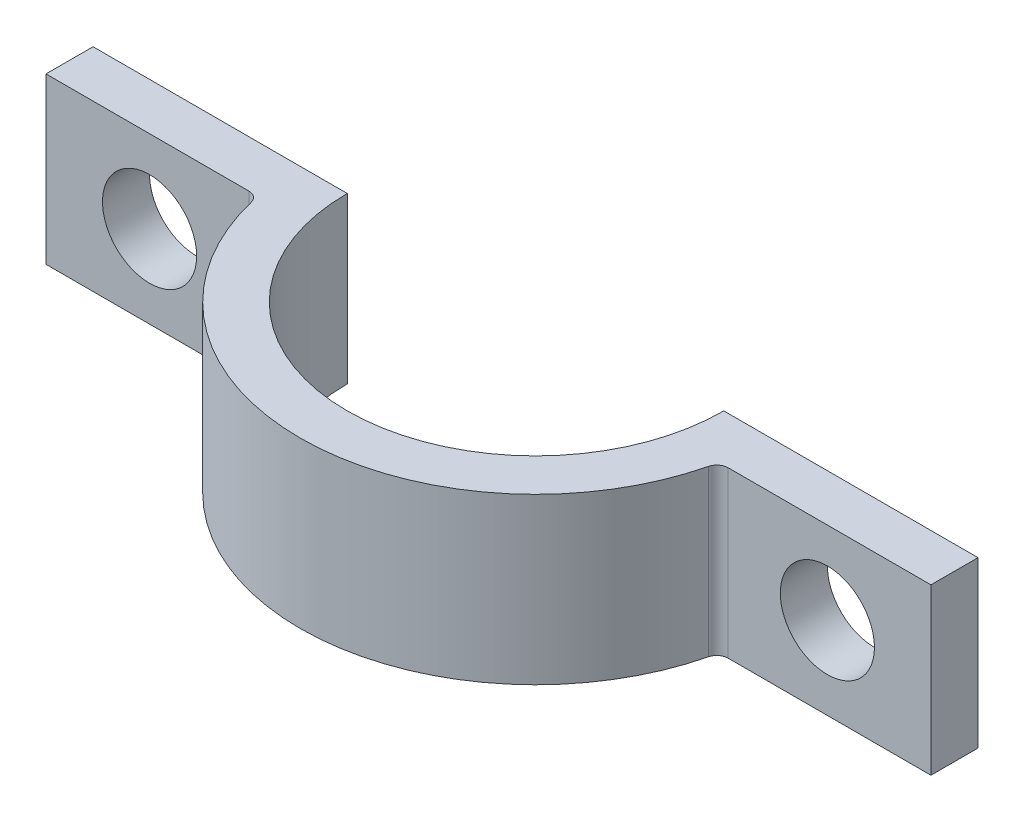
ISO-10303-21;
HEADER;
FILE_DESCRIPTION(('STEP AP214'),'2;1');
FILE_NAME('part.step','',(''),(''),'','','');
FILE_SCHEMA(('AUTOMOTIVE_DESIGN { 1 0 10303 214 1 1 1 1 }'));
ENDSEC;
DATA;
#1=APPLICATION_CONTEXT('core data for automotive mechanical design processes');
#2=APPLICATION_PROTOCOL_DEFINITION('international standard','automotive_design',2000,#1);
#3=PRODUCT_CONTEXT('',#1,'mechanical');
#4=PRODUCT('Part','Part','',(#3));
#5=PRODUCT_RELATED_PRODUCT_CATEGORY('part','',(#4));
#6=PRODUCT_DEFINITION_FORMATION('','',#4);
#7=PRODUCT_DEFINITION_CONTEXT('part definition',#1,'design');
#8=PRODUCT_DEFINITION('design','',#6,#7);
#9=PRODUCT_DEFINITION_SHAPE('','',#8);
#10=(LENGTH_UNIT() NAMED_UNIT(*) SI_UNIT(.MILLI.,.METRE.));
#11=(NAMED_UNIT(*) PLANE_ANGLE_UNIT() SI_UNIT($,.RADIAN.));
#12=(NAMED_UNIT(*) SI_UNIT($,.STERADIAN.) SOLID_ANGLE_UNIT());
#13=UNCERTAINTY_MEASURE_WITH_UNIT(LENGTH_MEASURE(1.E-05),#10,'distance_accuracy_value','');
#14=(GEOMETRIC_REPRESENTATION_CONTEXT(3) GLOBAL_UNCERTAINTY_ASSIGNED_CONTEXT((#13)) GLOBAL_UNIT_ASSIGNED_CONTEXT((#10,
#11,#12)) REPRESENTATION_CONTEXT('',''));
#15=CARTESIAN_POINT('',(0.,0.,0.));
#16=DIRECTION('',(0.,0.,1.));
#17=DIRECTION('',(1.,0.,0.));
#18=AXIS2_PLACEMENT_3D('',#15,#16,#17);
#19=CARTESIAN_POINT('',(0.,5.5626,0.));
#20=DIRECTION('',(0.,-1.,0.));
#21=DIRECTION('',(0.,0.,-1.));
#22=AXIS2_PLACEMENT_3D('',#19,#20,#21);
#23=CYLINDRICAL_SURFACE('',#22,12.7);
#24=CARTESIAN_POINT('',(0.,-5.5626,0.));
#25=DIRECTION('',(0.,-1.,0.));
#26=DIRECTION('',(0.,0.,1.));
#27=AXIS2_PLACEMENT_3D('',#24,#25,#26);
#28=CIRCLE('',#27,12.7);
#29=CARTESIAN_POINT('',(12.7,-5.5626,0.));
#30=VERTEX_POINT('',#29);
#31=CARTESIAN_POINT('',(-12.7,-5.5626,0.));
#32=VERTEX_POINT('',#31);
#33=EDGE_CURVE('E151',#30,#32,#28,.T.);
#34=ORIENTED_EDGE('',*,*,#33,.T.);
#35=DIRECTION('',(0.,-1.,0.));
#36=VECTOR('',#35,1.);
#37=CARTESIAN_POINT('',(-12.7,5.5626,0.));
#38=LINE('',#37,#36);
#39=CARTESIAN_POINT('',(-12.7,5.5626,0.));
#40=VERTEX_POINT('',#39);
#41=EDGE_CURVE('E11',#40,#32,#38,.T.);
#42=ORIENTED_EDGE('',*,*,#41,.F.);
#43=CARTESIAN_POINT('',(0.,5.5626,0.));
#44=DIRECTION('',(0.,-1.,0.));
#45=DIRECTION('',(0.,0.,1.));
#46=AXIS2_PLACEMENT_3D('',#43,#44,#45);
#47=CIRCLE('',#46,12.7);
#48=CARTESIAN_POINT('',(12.7,5.5626,0.));
#49=VERTEX_POINT('',#48);
#50=EDGE_CURVE('E170',#49,#40,#47,.T.);
#51=ORIENTED_EDGE('',*,*,#50,.F.);
#52=DIRECTION('',(0.,-1.,0.));
#53=VECTOR('',#52,1.);
#54=CARTESIAN_POINT('',(12.7,5.5626,0.));
#55=LINE('',#54,#53);
#56=EDGE_CURVE('E147',#49,#30,#55,.T.);
#57=ORIENTED_EDGE('',*,*,#56,.T.);
#58=EDGE_LOOP('',(#34,#42,#51,#57));
#59=FACE_BOUND('',#58,.T.);
#60=ADVANCED_FACE('F43',(#59),#23,.F.);
#61=CARTESIAN_POINT('',(-12.7,5.5626,0.));
#62=DIRECTION('',(0.,0.,1.));
#63=DIRECTION('',(1.,0.,0.));
#64=AXIS2_PLACEMENT_3D('',#61,#62,#63);
#65=PLANE('',#64);
#66=CARTESIAN_POINT('',(-22.86,0.,0.));
#67=DIRECTION('',(0.,0.,1.));
#68=DIRECTION('',(1.,0.,0.));
#69=AXIS2_PLACEMENT_3D('',#66,#67,#68);
#70=CIRCLE('',#69,3.175);
#71=CARTESIAN_POINT('',(-19.685,0.,0.));
#72=VERTEX_POINT('',#71);
#73=EDGE_CURVE('E155',#72,#72,#70,.T.);
#74=ORIENTED_EDGE('',*,*,#73,.T.);
#75=EDGE_LOOP('',(#74));
#76=FACE_BOUND('',#75,.T.);
#77=DIRECTION('',(-1.,0.,0.));
#78=VECTOR('',#77,1.);
#79=CARTESIAN_POINT('',(-12.7,-5.5626,0.));
#80=LINE('',#79,#78);
#81=CARTESIAN_POINT('',(-29.845,-5.5626,0.));
#82=VERTEX_POINT('',#81);
#83=EDGE_CURVE('E154',#32,#82,#80,.T.);
#84=ORIENTED_EDGE('',*,*,#83,.T.);
#85=DIRECTION('',(0.,-1.,0.));
#86=VECTOR('',#85,1.);
#87=CARTESIAN_POINT('',(-29.845,5.5626,0.));
#88=LINE('',#87,#86);
#89=CARTESIAN_POINT('',(-29.845,5.5626,0.));
#90=VERTEX_POINT('',#89);
#91=EDGE_CURVE('E51',#90,#82,#88,.T.);
#92=ORIENTED_EDGE('',*,*,#91,.F.);
#93=DIRECTION('',(-1.,0.,0.));
#94=VECTOR('',#93,1.);
#95=CARTESIAN_POINT('',(-12.7,5.5626,0.));
#96=LINE('',#95,#94);
#97=EDGE_CURVE('E108',#40,#90,#96,.T.);
#98=ORIENTED_EDGE('',*,*,#97,.F.);
#99=ORIENTED_EDGE('',*,*,#41,.T.);
#100=EDGE_LOOP('',(#84,#92,#98,#99));
#101=FACE_BOUND('',#100,.T.);
#102=ADVANCED_FACE('F229',(#76,#101),#65,.F.);
#103=CARTESIAN_POINT('',(-29.845,5.5626,0.));
#104=DIRECTION('',(1.,0.,0.));
#105=DIRECTION('',(0.,0.,-1.));
#106=AXIS2_PLACEMENT_3D('',#103,#104,#105);
#107=PLANE('',#106);
#108=DIRECTION('',(0.,0.,1.));
#109=VECTOR('',#108,1.);
#110=CARTESIAN_POINT('',(-29.845,-5.5626,0.));
#111=LINE('',#110,#109);
#112=CARTESIAN_POINT('',(-29.845,-5.5626,3.175));
#113=VERTEX_POINT('',#112);
#114=EDGE_CURVE('E157',#82,#113,#111,.T.);
#115=ORIENTED_EDGE('',*,*,#114,.T.);
#116=DIRECTION('',(0.,-1.,0.));
#117=VECTOR('',#116,1.);
#118=CARTESIAN_POINT('',(-29.845,5.5626,3.175));
#119=LINE('',#118,#117);
#120=CARTESIAN_POINT('',(-29.845,5.5626,3.175));
#121=VERTEX_POINT('',#120);
#122=EDGE_CURVE('E183',#121,#113,#119,.T.);
#123=ORIENTED_EDGE('',*,*,#122,.F.);
#124=DIRECTION('',(0.,0.,1.));
#125=VECTOR('',#124,1.);
#126=CARTESIAN_POINT('',(-29.845,5.5626,0.));
#127=LINE('',#126,#125);
#128=EDGE_CURVE('E191',#90,#121,#127,.T.);
#129=ORIENTED_EDGE('',*,*,#128,.F.);
#130=ORIENTED_EDGE('',*,*,#91,.T.);
#131=EDGE_LOOP('',(#115,#123,#129,#130));
#132=FACE_BOUND('',#131,.T.);
#133=ADVANCED_FACE('F189',(#132),#107,.F.);
#134=CARTESIAN_POINT('',(-29.845,5.5626,3.175));
#135=DIRECTION('',(0.,0.,-1.));
#136=DIRECTION('',(-1.,0.,0.));
#137=AXIS2_PLACEMENT_3D('',#134,#135,#136);
#138=PLANE('',#137);
#139=CARTESIAN_POINT('',(-22.86,0.,3.17500000000002));
#140=DIRECTION('',(0.,0.,1.));
#141=DIRECTION('',(1.,0.,0.));
#142=AXIS2_PLACEMENT_3D('',#139,#140,#141);
#143=CIRCLE('',#142,3.175);
#144=CARTESIAN_POINT('',(-19.685,0.,3.17500000000002));
#145=VERTEX_POINT('',#144);
#146=EDGE_CURVE('E223',#145,#145,#143,.T.);
#147=ORIENTED_EDGE('',*,*,#146,.F.);
#148=EDGE_LOOP('',(#147));
#149=FACE_BOUND('',#148,.T.);
#150=DIRECTION('',(1.,0.,0.));
#151=VECTOR('',#150,1.);
#152=CARTESIAN_POINT('',(-29.845,-5.5626,3.175));
#153=LINE('',#152,#151);
#154=CARTESIAN_POINT('',(-16.1644610179245,-5.5626,3.17500000000001));
#155=VERTEX_POINT('',#154);
#156=EDGE_CURVE('E159',#113,#155,#153,.T.);
#157=ORIENTED_EDGE('',*,*,#156,.T.);
#158=DIRECTION('',(0.,-1.,0.));
#159=VECTOR('',#158,1.);
#160=CARTESIAN_POINT('',(-16.1644610179245,5.5626,3.17500000000001));
#161=LINE('',#160,#159);
#162=CARTESIAN_POINT('',(-16.1644610179245,5.5626,3.17500000000001));
#163=VERTEX_POINT('',#162);
#164=EDGE_CURVE('E180',#163,#155,#161,.T.);
#165=ORIENTED_EDGE('',*,*,#164,.F.);
#166=DIRECTION('',(1.,0.,0.));
#167=VECTOR('',#166,1.);
#168=CARTESIAN_POINT('',(-29.845,5.5626,3.175));
#169=LINE('',#168,#167);
#170=EDGE_CURVE('E209',#121,#163,#169,.T.);
#171=ORIENTED_EDGE('',*,*,#170,.F.);
#172=ORIENTED_EDGE('',*,*,#122,.T.);
#173=EDGE_LOOP('',(#157,#165,#171,#172));
#174=FACE_BOUND('',#173,.T.);
#175=ADVANCED_FACE('F200',(#149,#174),#138,.F.);
#176=CARTESIAN_POINT('',(-16.1644610179245,5.5626,3.93700000000001));
#177=DIRECTION('',(0.,-1.,0.));
#178=DIRECTION('',(0.,0.,-1.));
#179=AXIS2_PLACEMENT_3D('',#176,#177,#178);
#180=CYLINDRICAL_SURFACE('',#179,0.761999999999999);
#181=CARTESIAN_POINT('',(-16.1644610179245,-5.5626,3.93700000000001));
#182=DIRECTION('',(0.,-1.,0.));
#183=DIRECTION('',(0.,0.,1.));
#184=AXIS2_PLACEMENT_3D('',#181,#182,#183);
#185=CIRCLE('',#184,0.761999999999999);
#186=CARTESIAN_POINT('',(-15.4241040247371,-5.5626,3.75667938931299));
#187=VERTEX_POINT('',#186);
#188=EDGE_CURVE('E161',#155,#187,#185,.T.);
#189=ORIENTED_EDGE('',*,*,#188,.T.);
#190=DIRECTION('',(0.,-1.,0.));
#191=VECTOR('',#190,1.);
#192=CARTESIAN_POINT('',(-15.4241040247371,5.5626,3.75667938931299));
#193=LINE('',#192,#191);
#194=CARTESIAN_POINT('',(-15.4241040247371,5.5626,3.75667938931299));
#195=VERTEX_POINT('',#194);
#196=EDGE_CURVE('E177',#195,#187,#193,.T.);
#197=ORIENTED_EDGE('',*,*,#196,.F.);
#198=CARTESIAN_POINT('',(-16.1644610179245,5.5626,3.93700000000001));
#199=DIRECTION('',(0.,-1.,0.));
#200=DIRECTION('',(0.,0.,1.));
#201=AXIS2_PLACEMENT_3D('',#198,#199,#200);
#202=CIRCLE('',#201,0.761999999999999);
#203=EDGE_CURVE('E206',#163,#195,#202,.T.);
#204=ORIENTED_EDGE('',*,*,#203,.F.);
#205=ORIENTED_EDGE('',*,*,#164,.T.);
#206=EDGE_LOOP('',(#189,#197,#204,#205));
#207=FACE_BOUND('',#206,.T.);
#208=ADVANCED_FACE('F204',(#207),#180,.F.);
#209=CARTESIAN_POINT('',(0.,5.5626,0.));
#210=DIRECTION('',(0.,-1.,0.));
#211=DIRECTION('',(0.,0.,-1.));
#212=AXIS2_PLACEMENT_3D('',#209,#210,#211);
#213=CYLINDRICAL_SURFACE('',#212,15.875);
#214=CARTESIAN_POINT('',(0.,-5.5626,0.));
#215=DIRECTION('',(0.,1.,0.));
#216=DIRECTION('',(0.,0.,1.));
#217=AXIS2_PLACEMENT_3D('',#214,#215,#216);
#218=CIRCLE('',#217,15.875);
#219=CARTESIAN_POINT('',(15.4241040247371,-5.5626,3.75667938931298));
#220=VERTEX_POINT('',#219);
#221=EDGE_CURVE('E163',#187,#220,#218,.T.);
#222=ORIENTED_EDGE('',*,*,#221,.T.);
#223=DIRECTION('',(0.,-1.,0.));
#224=VECTOR('',#223,1.);
#225=CARTESIAN_POINT('',(15.4241040247371,5.5626,3.75667938931298));
#226=LINE('',#225,#224);
#227=CARTESIAN_POINT('',(15.4241040247371,5.5626,3.75667938931298));
#228=VERTEX_POINT('',#227);
#229=EDGE_CURVE('E174',#228,#220,#226,.T.);
#230=ORIENTED_EDGE('',*,*,#229,.F.);
#231=CARTESIAN_POINT('',(0.,5.5626,0.));
#232=DIRECTION('',(0.,1.,0.));
#233=DIRECTION('',(0.,0.,1.));
#234=AXIS2_PLACEMENT_3D('',#231,#232,#233);
#235=CIRCLE('',#234,15.875);
#236=EDGE_CURVE('E208',#195,#228,#235,.T.);
#237=ORIENTED_EDGE('',*,*,#236,.F.);
#238=ORIENTED_EDGE('',*,*,#196,.T.);
#239=EDGE_LOOP('',(#222,#230,#237,#238));
#240=FACE_BOUND('',#239,.T.);
#241=ADVANCED_FACE('F245',(#240),#213,.T.);
#242=CARTESIAN_POINT('',(16.1644610179245,5.5626,3.93700000000001));
#243=DIRECTION('',(0.,-1.,0.));
#244=DIRECTION('',(0.,0.,-1.));
#245=AXIS2_PLACEMENT_3D('',#242,#243,#244);
#246=CYLINDRICAL_SURFACE('',#245,0.761999999999999);
#247=CARTESIAN_POINT('',(16.1644610179245,-5.5626,3.93700000000001));
#248=DIRECTION('',(0.,-1.,0.));
#249=DIRECTION('',(0.,0.,-1.));
#250=AXIS2_PLACEMENT_3D('',#247,#248,#249);
#251=CIRCLE('',#250,0.761999999999999);
#252=CARTESIAN_POINT('',(16.1644610179245,-5.5626,3.17500000000001));
#253=VERTEX_POINT('',#252);
#254=EDGE_CURVE('E165',#220,#253,#251,.T.);
#255=ORIENTED_EDGE('',*,*,#254,.T.);
#256=DIRECTION('',(0.,-1.,0.));
#257=VECTOR('',#256,1.);
#258=CARTESIAN_POINT('',(16.1644610179245,5.5626,3.17500000000001));
#259=LINE('',#258,#257);
#260=CARTESIAN_POINT('',(16.1644610179245,5.5626,3.17500000000001));
#261=VERTEX_POINT('',#260);
#262=EDGE_CURVE('E142',#261,#253,#259,.T.);
#263=ORIENTED_EDGE('',*,*,#262,.F.);
#264=CARTESIAN_POINT('',(16.1644610179245,5.5626,3.93700000000001));
#265=DIRECTION('',(0.,-1.,0.));
#266=DIRECTION('',(0.,0.,-1.));
#267=AXIS2_PLACEMENT_3D('',#264,#265,#266);
#268=CIRCLE('',#267,0.761999999999999);
#269=EDGE_CURVE('E133',#228,#261,#268,.T.);
#270=ORIENTED_EDGE('',*,*,#269,.F.);
#271=ORIENTED_EDGE('',*,*,#229,.T.);
#272=EDGE_LOOP('',(#255,#263,#270,#271));
#273=FACE_BOUND('',#272,.T.);
#274=ADVANCED_FACE('F257',(#273),#246,.F.);
#275=CARTESIAN_POINT('',(29.845,5.5626,3.175));
#276=DIRECTION('',(0.,0.,-1.));
#277=DIRECTION('',(-1.,0.,0.));
#278=AXIS2_PLACEMENT_3D('',#275,#276,#277);
#279=PLANE('',#278);
#280=CARTESIAN_POINT('',(22.86,0.,3.17500000000002));
#281=DIRECTION('',(0.,0.,1.));
#282=DIRECTION('',(1.,0.,0.));
#283=AXIS2_PLACEMENT_3D('',#280,#281,#282);
#284=CIRCLE('',#283,3.175);
#285=CARTESIAN_POINT('',(26.035,0.,3.17500000000002));
#286=VERTEX_POINT('',#285);
#287=EDGE_CURVE('E217',#286,#286,#284,.T.);
#288=ORIENTED_EDGE('',*,*,#287,.F.);
#289=EDGE_LOOP('',(#288));
#290=FACE_BOUND('',#289,.T.);
#291=DIRECTION('',(1.,0.,0.));
#292=VECTOR('',#291,1.);
#293=CARTESIAN_POINT('',(29.845,-5.5626,3.175));
#294=LINE('',#293,#292);
#295=CARTESIAN_POINT('',(29.845,-5.5626,3.175));
#296=VERTEX_POINT('',#295);
#297=EDGE_CURVE('E141',#253,#296,#294,.T.);
#298=ORIENTED_EDGE('',*,*,#297,.T.);
#299=DIRECTION('',(0.,-1.,0.));
#300=VECTOR('',#299,1.);
#301=CARTESIAN_POINT('',(29.845,5.5626,3.175));
#302=LINE('',#301,#300);
#303=CARTESIAN_POINT('',(29.845,5.5626,3.175));
#304=VERTEX_POINT('',#303);
#305=EDGE_CURVE('E138',#304,#296,#302,.T.);
#306=ORIENTED_EDGE('',*,*,#305,.F.);
#307=DIRECTION('',(1.,0.,0.));
#308=VECTOR('',#307,1.);
#309=CARTESIAN_POINT('',(29.845,5.5626,3.175));
#310=LINE('',#309,#308);
#311=EDGE_CURVE('E127',#261,#304,#310,.T.);
#312=ORIENTED_EDGE('',*,*,#311,.F.);
#313=ORIENTED_EDGE('',*,*,#262,.T.);
#314=EDGE_LOOP('',(#298,#306,#312,#313));
#315=FACE_BOUND('',#314,.T.);
#316=ADVANCED_FACE('F139',(#290,#315),#279,.F.);
#317=CARTESIAN_POINT('',(29.845,5.5626,0.));
#318=DIRECTION('',(-1.,0.,0.));
#319=DIRECTION('',(0.,0.,1.));
#320=AXIS2_PLACEMENT_3D('',#317,#318,#319);
#321=PLANE('',#320);
#322=DIRECTION('',(0.,0.,-1.));
#323=VECTOR('',#322,1.);
#324=CARTESIAN_POINT('',(29.845,-5.5626,0.));
#325=LINE('',#324,#323);
#326=CARTESIAN_POINT('',(29.845,-5.5626,0.));
#327=VERTEX_POINT('',#326);
#328=EDGE_CURVE('E94',#296,#327,#325,.T.);
#329=ORIENTED_EDGE('',*,*,#328,.T.);
#330=DIRECTION('',(0.,-1.,0.));
#331=VECTOR('',#330,1.);
#332=CARTESIAN_POINT('',(29.845,5.5626,0.));
#333=LINE('',#332,#331);
#334=CARTESIAN_POINT('',(29.845,5.5626,0.));
#335=VERTEX_POINT('',#334);
#336=EDGE_CURVE('E143',#335,#327,#333,.T.);
#337=ORIENTED_EDGE('',*,*,#336,.F.);
#338=DIRECTION('',(0.,0.,-1.));
#339=VECTOR('',#338,1.);
#340=CARTESIAN_POINT('',(29.845,5.5626,0.));
#341=LINE('',#340,#339);
#342=EDGE_CURVE('E131',#304,#335,#341,.T.);
#343=ORIENTED_EDGE('',*,*,#342,.F.);
#344=ORIENTED_EDGE('',*,*,#305,.T.);
#345=EDGE_LOOP('',(#329,#337,#343,#344));
#346=FACE_BOUND('',#345,.T.);
#347=ADVANCED_FACE('F145',(#346),#321,.F.);
#348=CARTESIAN_POINT('',(12.7,5.5626,0.));
#349=DIRECTION('',(0.,0.,1.));
#350=DIRECTION('',(1.,0.,0.));
#351=AXIS2_PLACEMENT_3D('',#348,#349,#350);
#352=PLANE('',#351);
#353=CARTESIAN_POINT('',(22.86,0.,0.));
#354=DIRECTION('',(0.,0.,1.));
#355=DIRECTION('',(1.,0.,0.));
#356=AXIS2_PLACEMENT_3D('',#353,#354,#355);
#357=CIRCLE('',#356,3.175);
#358=CARTESIAN_POINT('',(26.035,0.,0.));
#359=VERTEX_POINT('',#358);
#360=EDGE_CURVE('E220',#359,#359,#357,.T.);
#361=ORIENTED_EDGE('',*,*,#360,.T.);
#362=EDGE_LOOP('',(#361));
#363=FACE_BOUND('',#362,.T.);
#364=DIRECTION('',(-1.,0.,0.));
#365=VECTOR('',#364,1.);
#366=CARTESIAN_POINT('',(12.7,-5.5626,0.));
#367=LINE('',#366,#365);
#368=EDGE_CURVE('E100',#327,#30,#367,.T.);
#369=ORIENTED_EDGE('',*,*,#368,.T.);
#370=ORIENTED_EDGE('',*,*,#56,.F.);
#371=DIRECTION('',(-1.,0.,0.));
#372=VECTOR('',#371,1.);
#373=CARTESIAN_POINT('',(12.7,5.5626,0.));
#374=LINE('',#373,#372);
#375=EDGE_CURVE('E59',#335,#49,#374,.T.);
#376=ORIENTED_EDGE('',*,*,#375,.F.);
#377=ORIENTED_EDGE('',*,*,#336,.T.);
#378=EDGE_LOOP('',(#369,#370,#376,#377));
#379=FACE_BOUND('',#378,.T.);
#380=ADVANCED_FACE('F271',(#363,#379),#352,.F.);
#381=CARTESIAN_POINT('',(0.,5.5626,0.));
#382=DIRECTION('',(0.,1.,0.));
#383=DIRECTION('',(0.,0.,1.));
#384=AXIS2_PLACEMENT_3D('',#381,#382,#383);
#385=PLANE('',#384);
#386=ORIENTED_EDGE('',*,*,#50,.T.);
#387=ORIENTED_EDGE('',*,*,#97,.T.);
#388=ORIENTED_EDGE('',*,*,#128,.T.);
#389=ORIENTED_EDGE('',*,*,#170,.T.);
#390=ORIENTED_EDGE('',*,*,#203,.T.);
#391=ORIENTED_EDGE('',*,*,#236,.T.);
#392=ORIENTED_EDGE('',*,*,#269,.T.);
#393=ORIENTED_EDGE('',*,*,#311,.T.);
#394=ORIENTED_EDGE('',*,*,#342,.T.);
#395=ORIENTED_EDGE('',*,*,#375,.T.);
#396=EDGE_LOOP('',(#386,#387,#388,#389,#390,#391,#392,#393,#394,#395));
#397=FACE_BOUND('',#396,.T.);
#398=ADVANCED_FACE('F129',(#397),#385,.T.);
#399=CARTESIAN_POINT('',(0.,-5.5626,0.));
#400=DIRECTION('',(0.,1.,0.));
#401=DIRECTION('',(0.,0.,1.));
#402=AXIS2_PLACEMENT_3D('',#399,#400,#401);
#403=PLANE('',#402);
#404=ORIENTED_EDGE('',*,*,#33,.F.);
#405=ORIENTED_EDGE('',*,*,#368,.F.);
#406=ORIENTED_EDGE('',*,*,#328,.F.);
#407=ORIENTED_EDGE('',*,*,#297,.F.);
#408=ORIENTED_EDGE('',*,*,#254,.F.);
#409=ORIENTED_EDGE('',*,*,#221,.F.);
#410=ORIENTED_EDGE('',*,*,#188,.F.);
#411=ORIENTED_EDGE('',*,*,#156,.F.);
#412=ORIENTED_EDGE('',*,*,#114,.F.);
#413=ORIENTED_EDGE('',*,*,#83,.F.);
#414=EDGE_LOOP('',(#404,#405,#406,#407,#408,#409,#410,#411,#412,#413));
#415=FACE_BOUND('',#414,.T.);
#416=ADVANCED_FACE('F195',(#415),#403,.F.);
#417=CARTESIAN_POINT('',(22.86,0.,0.));
#418=DIRECTION('',(0.,0.,1.));
#419=DIRECTION('',(1.,0.,0.));
#420=AXIS2_PLACEMENT_3D('',#417,#418,#419);
#421=CYLINDRICAL_SURFACE('',#420,3.175);
#422=ORIENTED_EDGE('',*,*,#360,.F.);
#423=EDGE_LOOP('',(#422));
#424=FACE_BOUND('',#423,.T.);
#425=ORIENTED_EDGE('',*,*,#287,.T.);
#426=EDGE_LOOP('',(#425));
#427=FACE_BOUND('',#426,.T.);
#428=ADVANCED_FACE('F234',(#424,#427),#421,.F.);
#429=CARTESIAN_POINT('',(-22.86,0.,0.));
#430=DIRECTION('',(0.,0.,1.));
#431=DIRECTION('',(1.,0.,0.));
#432=AXIS2_PLACEMENT_3D('',#429,#430,#431);
#433=CYLINDRICAL_SURFACE('',#432,3.175);
#434=ORIENTED_EDGE('',*,*,#73,.F.);
#435=EDGE_LOOP('',(#434));
#436=FACE_BOUND('',#435,.T.);
#437=ORIENTED_EDGE('',*,*,#146,.T.);
#438=EDGE_LOOP('',(#437));
#439=FACE_BOUND('',#438,.T.);
#440=ADVANCED_FACE('F231',(#436,#439),#433,.F.);
#441=CLOSED_SHELL('',(#60,#102,#133,#175,#208,#241,#274,#316,#347,#380,#398,#416,#428,#440));
#442=MANIFOLD_SOLID_BREP('B2',#441);
#443=ADVANCED_BREP_SHAPE_REPRESENTATION('',(#18,#442),#14);
#444=SHAPE_DEFINITION_REPRESENTATION(#9,#443);
ENDSEC;
END-ISO-10303-21;
